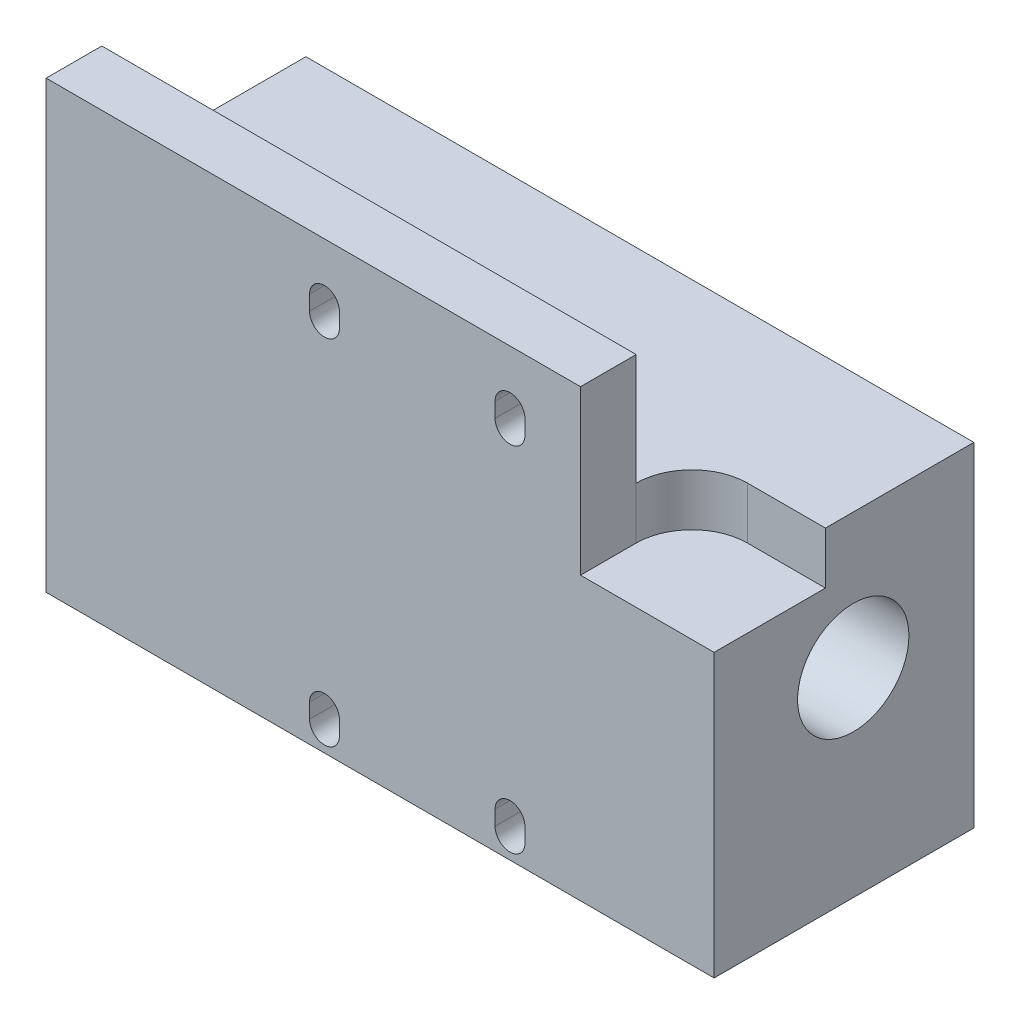
ISO-10303-21;
HEADER;
FILE_DESCRIPTION(('STEP AP214'),'2;1');
FILE_NAME('part.step','',(''),(''),'','','');
FILE_SCHEMA(('AUTOMOTIVE_DESIGN { 1 0 10303 214 1 1 1 1 }'));
ENDSEC;
DATA;
#1=APPLICATION_CONTEXT('core data for automotive mechanical design processes');
#2=APPLICATION_PROTOCOL_DEFINITION('international standard','automotive_design',2000,#1);
#3=PRODUCT_CONTEXT('',#1,'mechanical');
#4=PRODUCT('Part','Part','',(#3));
#5=PRODUCT_RELATED_PRODUCT_CATEGORY('part','',(#4));
#6=PRODUCT_DEFINITION_FORMATION('','',#4);
#7=PRODUCT_DEFINITION_CONTEXT('part definition',#1,'design');
#8=PRODUCT_DEFINITION('design','',#6,#7);
#9=PRODUCT_DEFINITION_SHAPE('','',#8);
#10=(LENGTH_UNIT() NAMED_UNIT(*) SI_UNIT(.MILLI.,.METRE.));
#11=(NAMED_UNIT(*) PLANE_ANGLE_UNIT() SI_UNIT($,.RADIAN.));
#12=(NAMED_UNIT(*) SI_UNIT($,.STERADIAN.) SOLID_ANGLE_UNIT());
#13=UNCERTAINTY_MEASURE_WITH_UNIT(LENGTH_MEASURE(1.E-05),#10,'distance_accuracy_value','');
#14=(GEOMETRIC_REPRESENTATION_CONTEXT(3) GLOBAL_UNCERTAINTY_ASSIGNED_CONTEXT((#13)) GLOBAL_UNIT_ASSIGNED_CONTEXT((#10,
#11,#12)) REPRESENTATION_CONTEXT('',''));
#15=CARTESIAN_POINT('',(0.,0.,0.));
#16=DIRECTION('',(0.,0.,1.));
#17=DIRECTION('',(1.,0.,0.));
#18=AXIS2_PLACEMENT_3D('',#15,#16,#17);
#19=CARTESIAN_POINT('',(114.3,38.1,-22.225));
#20=DIRECTION('',(0.,0.,1.));
#21=DIRECTION('',(0.,-1.,0.));
#22=AXIS2_PLACEMENT_3D('',#19,#20,#21);
#23=PLANE('',#22);
#24=CARTESIAN_POINT('',(79.375,-34.3535,-22.225));
#25=DIRECTION('',(0.,0.,1.));
#26=DIRECTION('',(0.,-1.,0.));
#27=AXIS2_PLACEMENT_3D('',#24,#25,#26);
#28=CIRCLE('',#27,2.55270000000001);
#29=CARTESIAN_POINT('',(81.9277,-34.3535,-22.225));
#30=VERTEX_POINT('',#29);
#31=CARTESIAN_POINT('',(76.8223,-34.3535,-22.225));
#32=VERTEX_POINT('',#31);
#33=EDGE_CURVE('E386',#30,#32,#28,.F.);
#34=ORIENTED_EDGE('',*,*,#33,.F.);
#35=DIRECTION('',(0.,-1.,0.));
#36=VECTOR('',#35,1.);
#37=CARTESIAN_POINT('',(81.9277,-31.8135,-22.225));
#38=LINE('',#37,#36);
#39=CARTESIAN_POINT('',(81.9277,-31.8135,-22.225));
#40=VERTEX_POINT('',#39);
#41=EDGE_CURVE('E389',#40,#30,#38,.T.);
#42=ORIENTED_EDGE('',*,*,#41,.F.);
#43=CARTESIAN_POINT('',(79.375,-31.8135,-22.225));
#44=DIRECTION('',(0.,0.,-1.));
#45=DIRECTION('',(0.,1.,0.));
#46=AXIS2_PLACEMENT_3D('',#43,#44,#45);
#47=CIRCLE('',#46,2.55269999999999);
#48=CARTESIAN_POINT('',(76.8223,-31.8135,-22.225));
#49=VERTEX_POINT('',#48);
#50=EDGE_CURVE('E470',#49,#40,#47,.T.);
#51=ORIENTED_EDGE('',*,*,#50,.F.);
#52=DIRECTION('',(0.,1.,0.));
#53=VECTOR('',#52,1.);
#54=CARTESIAN_POINT('',(76.8223,-31.8135,-22.225));
#55=LINE('',#54,#53);
#56=EDGE_CURVE('E58',#32,#49,#55,.T.);
#57=ORIENTED_EDGE('',*,*,#56,.F.);
#58=EDGE_LOOP('',(#34,#42,#51,#57));
#59=FACE_BOUND('',#58,.T.);
#60=DIRECTION('',(-1.,0.,0.));
#61=VECTOR('',#60,1.);
#62=CARTESIAN_POINT('',(114.301,19.05,-22.225));
#63=LINE('',#62,#61);
#64=CARTESIAN_POINT('',(114.3,19.05,-22.225));
#65=VERTEX_POINT('',#64);
#66=CARTESIAN_POINT('',(0.,19.05,-22.225));
#67=VERTEX_POINT('',#66);
#68=EDGE_CURVE('E252',#65,#67,#63,.T.);
#69=ORIENTED_EDGE('',*,*,#68,.F.);
#70=DIRECTION('',(0.,1.,0.));
#71=VECTOR('',#70,1.);
#72=CARTESIAN_POINT('',(114.3,38.1,-22.225));
#73=LINE('',#72,#71);
#74=CARTESIAN_POINT('',(114.3,-38.1,-22.225));
#75=VERTEX_POINT('',#74);
#76=EDGE_CURVE('E288',#75,#65,#73,.T.);
#77=ORIENTED_EDGE('',*,*,#76,.F.);
#78=DIRECTION('',(-1.,0.,0.));
#79=VECTOR('',#78,1.);
#80=CARTESIAN_POINT('',(114.3,-38.1,-22.225));
#81=LINE('',#80,#79);
#82=CARTESIAN_POINT('',(0.,-38.1,-22.225));
#83=VERTEX_POINT('',#82);
#84=EDGE_CURVE('E296',#75,#83,#81,.T.);
#85=ORIENTED_EDGE('',*,*,#84,.T.);
#86=DIRECTION('',(0.,1.,0.));
#87=VECTOR('',#86,1.);
#88=CARTESIAN_POINT('',(0.,38.1,-22.225));
#89=LINE('',#88,#87);
#90=EDGE_CURVE('E287',#83,#67,#89,.T.);
#91=ORIENTED_EDGE('',*,*,#90,.T.);
#92=EDGE_LOOP('',(#69,#77,#85,#91));
#93=FACE_BOUND('',#92,.T.);
#94=CARTESIAN_POINT('',(47.625,-34.3535,-22.225));
#95=DIRECTION('',(0.,0.,1.));
#96=DIRECTION('',(0.,-1.,0.));
#97=AXIS2_PLACEMENT_3D('',#94,#95,#96);
#98=CIRCLE('',#97,2.5527);
#99=CARTESIAN_POINT('',(50.1777,-34.3535,-22.225));
#100=VERTEX_POINT('',#99);
#101=CARTESIAN_POINT('',(45.0723,-34.3535,-22.225));
#102=VERTEX_POINT('',#101);
#103=EDGE_CURVE('E224',#100,#102,#98,.F.);
#104=ORIENTED_EDGE('',*,*,#103,.F.);
#105=DIRECTION('',(0.,-1.,0.));
#106=VECTOR('',#105,1.);
#107=CARTESIAN_POINT('',(50.1777,-31.8135,-22.225));
#108=LINE('',#107,#106);
#109=CARTESIAN_POINT('',(50.1777,-31.8135,-22.225));
#110=VERTEX_POINT('',#109);
#111=EDGE_CURVE('E490',#110,#100,#108,.T.);
#112=ORIENTED_EDGE('',*,*,#111,.F.);
#113=CARTESIAN_POINT('',(47.625,-31.8135,-22.225));
#114=DIRECTION('',(0.,0.,-1.));
#115=DIRECTION('',(0.,1.,0.));
#116=AXIS2_PLACEMENT_3D('',#113,#114,#115);
#117=CIRCLE('',#116,2.55269999999999);
#118=CARTESIAN_POINT('',(45.0723,-31.8135,-22.225));
#119=VERTEX_POINT('',#118);
#120=EDGE_CURVE('E223',#119,#110,#117,.T.);
#121=ORIENTED_EDGE('',*,*,#120,.F.);
#122=DIRECTION('',(0.,1.,0.));
#123=VECTOR('',#122,1.);
#124=CARTESIAN_POINT('',(45.0723,-31.8135,-22.225));
#125=LINE('',#124,#123);
#126=EDGE_CURVE('E50',#102,#119,#125,.T.);
#127=ORIENTED_EDGE('',*,*,#126,.F.);
#128=EDGE_LOOP('',(#104,#112,#121,#127));
#129=FACE_BOUND('',#128,.T.);
#130=ADVANCED_FACE('F35',(#59,#93,#129),#23,.F.);
#131=CARTESIAN_POINT('',(114.3,38.1,22.225));
#132=DIRECTION('',(0.,-1.,0.));
#133=DIRECTION('',(0.,0.,-1.));
#134=AXIS2_PLACEMENT_3D('',#131,#132,#133);
#135=PLANE('',#134);
#136=DIRECTION('',(-1.,0.,0.));
#137=VECTOR('',#136,1.);
#138=CARTESIAN_POINT('',(114.301,38.1,12.7));
#139=LINE('',#138,#137);
#140=CARTESIAN_POINT('',(91.44,38.1,12.7));
#141=VERTEX_POINT('',#140);
#142=CARTESIAN_POINT('',(0.,38.1,12.7));
#143=VERTEX_POINT('',#142);
#144=EDGE_CURVE('E256',#141,#143,#139,.T.);
#145=ORIENTED_EDGE('',*,*,#144,.T.);
#146=DIRECTION('',(0.,0.,1.));
#147=VECTOR('',#146,1.);
#148=CARTESIAN_POINT('',(0.,38.1,22.225));
#149=LINE('',#148,#147);
#150=CARTESIAN_POINT('',(0.,38.1,22.225));
#151=VERTEX_POINT('',#150);
#152=EDGE_CURVE('E299',#143,#151,#149,.T.);
#153=ORIENTED_EDGE('',*,*,#152,.T.);
#154=DIRECTION('',(-1.,0.,0.));
#155=VECTOR('',#154,1.);
#156=CARTESIAN_POINT('',(114.3,38.1,22.225));
#157=LINE('',#156,#155);
#158=CARTESIAN_POINT('',(91.44,38.1,22.225));
#159=VERTEX_POINT('',#158);
#160=EDGE_CURVE('E309',#159,#151,#157,.T.);
#161=ORIENTED_EDGE('',*,*,#160,.F.);
#162=DIRECTION('',(0.,0.,1.));
#163=VECTOR('',#162,1.);
#164=CARTESIAN_POINT('',(91.44,38.1,3.17499999999999));
#165=LINE('',#164,#163);
#166=EDGE_CURVE('E271',#141,#159,#165,.T.);
#167=ORIENTED_EDGE('',*,*,#166,.F.);
#168=EDGE_LOOP('',(#145,#153,#161,#167));
#169=FACE_BOUND('',#168,.T.);
#170=ADVANCED_FACE('F355',(#169),#135,.F.);
#171=CARTESIAN_POINT('',(114.3,0.,0.));
#172=DIRECTION('',(1.,0.,0.));
#173=DIRECTION('',(0.,0.,-1.));
#174=AXIS2_PLACEMENT_3D('',#171,#172,#173);
#175=PLANE('',#174);
#176=CARTESIAN_POINT('',(114.3,-4.01319999999999,-1.588));
#177=DIRECTION('',(1.,0.,0.));
#178=DIRECTION('',(0.,0.,-1.));
#179=AXIS2_PLACEMENT_3D('',#176,#177,#178);
#180=CIRCLE('',#179,9.525);
#181=CARTESIAN_POINT('',(114.3,-4.01319999999999,-11.113));
#182=VERTEX_POINT('',#181);
#183=EDGE_CURVE('E278',#182,#182,#180,.T.);
#184=ORIENTED_EDGE('',*,*,#183,.F.);
#185=EDGE_LOOP('',(#184));
#186=FACE_BOUND('',#185,.T.);
#187=ORIENTED_EDGE('',*,*,#76,.T.);
#188=DIRECTION('',(0.,0.,-1.));
#189=VECTOR('',#188,1.);
#190=CARTESIAN_POINT('',(114.3,19.05,-22.225));
#191=LINE('',#190,#189);
#192=CARTESIAN_POINT('',(114.3,19.05,3.17499999999999));
#193=VERTEX_POINT('',#192);
#194=EDGE_CURVE('E262',#193,#65,#191,.T.);
#195=ORIENTED_EDGE('',*,*,#194,.F.);
#196=DIRECTION('',(0.,1.,0.));
#197=VECTOR('',#196,1.);
#198=CARTESIAN_POINT('',(114.3,38.1,3.17499999999999));
#199=LINE('',#198,#197);
#200=CARTESIAN_POINT('',(114.3,10.16,3.17499999999999));
#201=VERTEX_POINT('',#200);
#202=EDGE_CURVE('E265',#201,#193,#199,.T.);
#203=ORIENTED_EDGE('',*,*,#202,.F.);
#204=DIRECTION('',(0.,0.,1.));
#205=VECTOR('',#204,1.);
#206=CARTESIAN_POINT('',(114.3,10.16,3.17499999999999));
#207=LINE('',#206,#205);
#208=CARTESIAN_POINT('',(114.3,10.16,22.225));
#209=VERTEX_POINT('',#208);
#210=EDGE_CURVE('E275',#201,#209,#207,.T.);
#211=ORIENTED_EDGE('',*,*,#210,.T.);
#212=DIRECTION('',(0.,-1.,0.));
#213=VECTOR('',#212,1.);
#214=CARTESIAN_POINT('',(114.3,38.1,22.225));
#215=LINE('',#214,#213);
#216=CARTESIAN_POINT('',(114.3,-38.1,22.225));
#217=VERTEX_POINT('',#216);
#218=EDGE_CURVE('E291',#209,#217,#215,.T.);
#219=ORIENTED_EDGE('',*,*,#218,.T.);
#220=DIRECTION('',(0.,0.,-1.));
#221=VECTOR('',#220,1.);
#222=CARTESIAN_POINT('',(114.3,-38.1,22.225));
#223=LINE('',#222,#221);
#224=EDGE_CURVE('E294',#217,#75,#223,.T.);
#225=ORIENTED_EDGE('',*,*,#224,.T.);
#226=EDGE_LOOP('',(#187,#195,#203,#211,#219,#225));
#227=FACE_BOUND('',#226,.T.);
#228=ADVANCED_FACE('F342',(#186,#227),#175,.T.);
#229=CARTESIAN_POINT('',(0.,0.,0.));
#230=DIRECTION('',(1.,0.,0.));
#231=DIRECTION('',(0.,0.,-1.));
#232=AXIS2_PLACEMENT_3D('',#229,#230,#231);
#233=PLANE('',#232);
#234=CARTESIAN_POINT('',(0.,-4.01319999999999,-1.588));
#235=DIRECTION('',(1.,0.,0.));
#236=DIRECTION('',(0.,0.,-1.));
#237=AXIS2_PLACEMENT_3D('',#234,#235,#236);
#238=CIRCLE('',#237,9.525);
#239=CARTESIAN_POINT('',(0.,-4.01319999999999,-11.113));
#240=VERTEX_POINT('',#239);
#241=EDGE_CURVE('E284',#240,#240,#238,.F.);
#242=ORIENTED_EDGE('',*,*,#241,.F.);
#243=EDGE_LOOP('',(#242));
#244=FACE_BOUND('',#243,.T.);
#245=DIRECTION('',(0.,-1.,0.));
#246=VECTOR('',#245,1.);
#247=CARTESIAN_POINT('',(0.,38.1,12.7));
#248=LINE('',#247,#246);
#249=CARTESIAN_POINT('',(0.,19.05,12.7));
#250=VERTEX_POINT('',#249);
#251=EDGE_CURVE('E246',#143,#250,#248,.T.);
#252=ORIENTED_EDGE('',*,*,#251,.T.);
#253=DIRECTION('',(0.,0.,-1.));
#254=VECTOR('',#253,1.);
#255=CARTESIAN_POINT('',(0.,19.05,-22.225));
#256=LINE('',#255,#254);
#257=EDGE_CURVE('E249',#250,#67,#256,.T.);
#258=ORIENTED_EDGE('',*,*,#257,.T.);
#259=ORIENTED_EDGE('',*,*,#90,.F.);
#260=DIRECTION('',(0.,0.,-1.));
#261=VECTOR('',#260,1.);
#262=CARTESIAN_POINT('',(0.,-38.1,22.225));
#263=LINE('',#262,#261);
#264=CARTESIAN_POINT('',(0.,-38.1,22.225));
#265=VERTEX_POINT('',#264);
#266=EDGE_CURVE('E292',#265,#83,#263,.T.);
#267=ORIENTED_EDGE('',*,*,#266,.F.);
#268=DIRECTION('',(0.,-1.,0.));
#269=VECTOR('',#268,1.);
#270=CARTESIAN_POINT('',(0.,38.1,22.225));
#271=LINE('',#270,#269);
#272=EDGE_CURVE('E301',#151,#265,#271,.T.);
#273=ORIENTED_EDGE('',*,*,#272,.F.);
#274=ORIENTED_EDGE('',*,*,#152,.F.);
#275=EDGE_LOOP('',(#252,#258,#259,#267,#273,#274));
#276=FACE_BOUND('',#275,.T.);
#277=ADVANCED_FACE('F351',(#244,#276),#233,.F.);
#278=CARTESIAN_POINT('',(91.44,38.1,3.17499999999999));
#279=DIRECTION('',(-1.,0.,0.));
#280=DIRECTION('',(0.,0.,1.));
#281=AXIS2_PLACEMENT_3D('',#278,#279,#280);
#282=PLANE('',#281);
#283=DIRECTION('',(0.,0.,1.));
#284=VECTOR('',#283,1.);
#285=CARTESIAN_POINT('',(91.44,10.16,3.17499999999999));
#286=LINE('',#285,#284);
#287=CARTESIAN_POINT('',(91.44,10.16,12.7));
#288=VERTEX_POINT('',#287);
#289=CARTESIAN_POINT('',(91.44,10.16,22.225));
#290=VERTEX_POINT('',#289);
#291=EDGE_CURVE('E279',#288,#290,#286,.T.);
#292=ORIENTED_EDGE('',*,*,#291,.F.);
#293=DIRECTION('',(0.,-1.,0.));
#294=VECTOR('',#293,1.);
#295=CARTESIAN_POINT('',(91.44,19.05,12.7));
#296=LINE('',#295,#294);
#297=CARTESIAN_POINT('',(91.44,19.05,12.7));
#298=VERTEX_POINT('',#297);
#299=EDGE_CURVE('E43',#288,#298,#296,.F.);
#300=ORIENTED_EDGE('',*,*,#299,.T.);
#301=DIRECTION('',(0.,1.,0.));
#302=VECTOR('',#301,1.);
#303=CARTESIAN_POINT('',(91.44,38.1,12.7));
#304=LINE('',#303,#302);
#305=EDGE_CURVE('E243',#298,#141,#304,.T.);
#306=ORIENTED_EDGE('',*,*,#305,.T.);
#307=ORIENTED_EDGE('',*,*,#166,.T.);
#308=DIRECTION('',(0.,-1.,0.));
#309=VECTOR('',#308,1.);
#310=CARTESIAN_POINT('',(91.44,38.1,22.225));
#311=LINE('',#310,#309);
#312=EDGE_CURVE('E264',#159,#290,#311,.T.);
#313=ORIENTED_EDGE('',*,*,#312,.T.);
#314=EDGE_LOOP('',(#292,#300,#306,#307,#313));
#315=FACE_BOUND('',#314,.T.);
#316=ADVANCED_FACE('F320',(#315),#282,.F.);
#317=CARTESIAN_POINT('',(0.,0.,3.17499999999999));
#318=DIRECTION('',(0.,0.,-1.));
#319=DIRECTION('',(-1.,0.,0.));
#320=AXIS2_PLACEMENT_3D('',#317,#318,#319);
#321=PLANE('',#320);
#322=DIRECTION('',(-1.,0.,0.));
#323=VECTOR('',#322,1.);
#324=CARTESIAN_POINT('',(114.301,19.05,3.17499999999999));
#325=LINE('',#324,#323);
#326=CARTESIAN_POINT('',(100.965,19.05,3.17499999999999));
#327=VERTEX_POINT('',#326);
#328=EDGE_CURVE('E259',#193,#327,#325,.T.);
#329=ORIENTED_EDGE('',*,*,#328,.T.);
#330=DIRECTION('',(0.,-1.,0.));
#331=VECTOR('',#330,1.);
#332=CARTESIAN_POINT('',(100.965,10.16,3.17499999999999));
#333=LINE('',#332,#331);
#334=CARTESIAN_POINT('',(100.965,10.16,3.17499999999999));
#335=VERTEX_POINT('',#334);
#336=EDGE_CURVE('E312',#327,#335,#333,.T.);
#337=ORIENTED_EDGE('',*,*,#336,.T.);
#338=DIRECTION('',(1.,0.,0.));
#339=VECTOR('',#338,1.);
#340=CARTESIAN_POINT('',(114.3,10.16,3.17499999999999));
#341=LINE('',#340,#339);
#342=EDGE_CURVE('E268',#335,#201,#341,.T.);
#343=ORIENTED_EDGE('',*,*,#342,.T.);
#344=ORIENTED_EDGE('',*,*,#202,.T.);
#345=EDGE_LOOP('',(#329,#337,#343,#344));
#346=FACE_BOUND('',#345,.T.);
#347=ADVANCED_FACE('F333',(#346),#321,.F.);
#348=CARTESIAN_POINT('',(114.3,38.1,22.225));
#349=DIRECTION('',(0.,0.,-1.));
#350=DIRECTION('',(0.,1.,0.));
#351=AXIS2_PLACEMENT_3D('',#348,#349,#350);
#352=PLANE('',#351);
#353=CARTESIAN_POINT('',(47.625,28.6385,22.225));
#354=DIRECTION('',(0.,0.,-1.));
#355=DIRECTION('',(0.,1.,0.));
#356=AXIS2_PLACEMENT_3D('',#353,#354,#355);
#357=CIRCLE('',#356,2.55269999999999);
#358=CARTESIAN_POINT('',(45.0723,28.6385,22.225));
#359=VERTEX_POINT('',#358);
#360=CARTESIAN_POINT('',(50.1777,28.6385,22.225));
#361=VERTEX_POINT('',#360);
#362=EDGE_CURVE('E464',#359,#361,#357,.T.);
#363=ORIENTED_EDGE('',*,*,#362,.T.);
#364=DIRECTION('',(0.,1.,0.));
#365=VECTOR('',#364,1.);
#366=CARTESIAN_POINT('',(50.1777,28.6385,22.225));
#367=LINE('',#366,#365);
#368=CARTESIAN_POINT('',(50.1777,26.0985,22.225));
#369=VERTEX_POINT('',#368);
#370=EDGE_CURVE('E455',#369,#361,#367,.T.);
#371=ORIENTED_EDGE('',*,*,#370,.F.);
#372=CARTESIAN_POINT('',(47.625,26.0985,22.225));
#373=DIRECTION('',(0.,0.,1.));
#374=DIRECTION('',(1.,0.,0.));
#375=AXIS2_PLACEMENT_3D('',#372,#373,#374);
#376=CIRCLE('',#375,2.55269999999998);
#377=CARTESIAN_POINT('',(45.0723,26.0985,22.225));
#378=VERTEX_POINT('',#377);
#379=EDGE_CURVE('E452',#378,#369,#376,.T.);
#380=ORIENTED_EDGE('',*,*,#379,.F.);
#381=DIRECTION('',(0.,-1.,0.));
#382=VECTOR('',#381,1.);
#383=CARTESIAN_POINT('',(45.0723,28.6385,22.225));
#384=LINE('',#383,#382);
#385=EDGE_CURVE('E449',#359,#378,#384,.T.);
#386=ORIENTED_EDGE('',*,*,#385,.F.);
#387=EDGE_LOOP('',(#363,#371,#380,#386));
#388=FACE_BOUND('',#387,.T.);
#389=CARTESIAN_POINT('',(79.375,-31.8135,22.225));
#390=DIRECTION('',(0.,0.,-1.));
#391=DIRECTION('',(0.,1.,0.));
#392=AXIS2_PLACEMENT_3D('',#389,#390,#391);
#393=CIRCLE('',#392,2.55269999999999);
#394=CARTESIAN_POINT('',(76.8223,-31.8135,22.225));
#395=VERTEX_POINT('',#394);
#396=CARTESIAN_POINT('',(81.9277,-31.8135,22.225));
#397=VERTEX_POINT('',#396);
#398=EDGE_CURVE('E237',#395,#397,#393,.T.);
#399=ORIENTED_EDGE('',*,*,#398,.T.);
#400=DIRECTION('',(0.,1.,0.));
#401=VECTOR('',#400,1.);
#402=CARTESIAN_POINT('',(81.9277,-31.8135,22.225));
#403=LINE('',#402,#401);
#404=CARTESIAN_POINT('',(81.9277,-34.3535,22.225));
#405=VERTEX_POINT('',#404);
#406=EDGE_CURVE('E405',#405,#397,#403,.T.);
#407=ORIENTED_EDGE('',*,*,#406,.F.);
#408=CARTESIAN_POINT('',(79.375,-34.3535,22.225));
#409=DIRECTION('',(0.,0.,1.));
#410=DIRECTION('',(1.,0.,0.));
#411=AXIS2_PLACEMENT_3D('',#408,#409,#410);
#412=CIRCLE('',#411,2.55270000000001);
#413=CARTESIAN_POINT('',(76.8223,-34.3535,22.225));
#414=VERTEX_POINT('',#413);
#415=EDGE_CURVE('E402',#414,#405,#412,.T.);
#416=ORIENTED_EDGE('',*,*,#415,.F.);
#417=DIRECTION('',(0.,-1.,0.));
#418=VECTOR('',#417,1.);
#419=CARTESIAN_POINT('',(76.8223,-31.8135,22.225));
#420=LINE('',#419,#418);
#421=EDGE_CURVE('E394',#395,#414,#420,.T.);
#422=ORIENTED_EDGE('',*,*,#421,.F.);
#423=EDGE_LOOP('',(#399,#407,#416,#422));
#424=FACE_BOUND('',#423,.T.);
#425=CARTESIAN_POINT('',(47.625,-31.8135,22.225));
#426=DIRECTION('',(0.,0.,-1.));
#427=DIRECTION('',(0.,1.,0.));
#428=AXIS2_PLACEMENT_3D('',#425,#426,#427);
#429=CIRCLE('',#428,2.55269999999999);
#430=CARTESIAN_POINT('',(45.0723,-31.8135,22.225));
#431=VERTEX_POINT('',#430);
#432=CARTESIAN_POINT('',(50.1777,-31.8135,22.225));
#433=VERTEX_POINT('',#432);
#434=EDGE_CURVE('E221',#431,#433,#429,.T.);
#435=ORIENTED_EDGE('',*,*,#434,.T.);
#436=DIRECTION('',(0.,1.,0.));
#437=VECTOR('',#436,1.);
#438=CARTESIAN_POINT('',(50.1777,-31.8135,22.225));
#439=LINE('',#438,#437);
#440=CARTESIAN_POINT('',(50.1777,-34.3535,22.225));
#441=VERTEX_POINT('',#440);
#442=EDGE_CURVE('E203',#441,#433,#439,.T.);
#443=ORIENTED_EDGE('',*,*,#442,.F.);
#444=CARTESIAN_POINT('',(47.625,-34.3535,22.225));
#445=DIRECTION('',(0.,0.,1.));
#446=DIRECTION('',(1.,0.,0.));
#447=AXIS2_PLACEMENT_3D('',#444,#445,#446);
#448=CIRCLE('',#447,2.5527);
#449=CARTESIAN_POINT('',(45.0723,-34.3535,22.225));
#450=VERTEX_POINT('',#449);
#451=EDGE_CURVE('E215',#450,#441,#448,.T.);
#452=ORIENTED_EDGE('',*,*,#451,.F.);
#453=DIRECTION('',(0.,-1.,0.));
#454=VECTOR('',#453,1.);
#455=CARTESIAN_POINT('',(45.0723,-31.8135,22.225));
#456=LINE('',#455,#454);
#457=EDGE_CURVE('E231',#431,#450,#456,.T.);
#458=ORIENTED_EDGE('',*,*,#457,.F.);
#459=EDGE_LOOP('',(#435,#443,#452,#458));
#460=FACE_BOUND('',#459,.T.);
#461=CARTESIAN_POINT('',(79.375,28.6385,22.225));
#462=DIRECTION('',(0.,0.,-1.));
#463=DIRECTION('',(0.,1.,0.));
#464=AXIS2_PLACEMENT_3D('',#461,#462,#463);
#465=CIRCLE('',#464,2.55269999999999);
#466=CARTESIAN_POINT('',(76.8223,28.6385,22.225));
#467=VERTEX_POINT('',#466);
#468=CARTESIAN_POINT('',(81.9277,28.6385,22.225));
#469=VERTEX_POINT('',#468);
#470=EDGE_CURVE('E232',#467,#469,#465,.T.);
#471=ORIENTED_EDGE('',*,*,#470,.T.);
#472=DIRECTION('',(0.,1.,0.));
#473=VECTOR('',#472,1.);
#474=CARTESIAN_POINT('',(81.9277,28.6385,22.225));
#475=LINE('',#474,#473);
#476=CARTESIAN_POINT('',(81.9277,26.0985,22.225));
#477=VERTEX_POINT('',#476);
#478=EDGE_CURVE('E429',#477,#469,#475,.T.);
#479=ORIENTED_EDGE('',*,*,#478,.F.);
#480=CARTESIAN_POINT('',(79.375,26.0985,22.225));
#481=DIRECTION('',(0.,0.,1.));
#482=DIRECTION('',(1.,0.,0.));
#483=AXIS2_PLACEMENT_3D('',#480,#481,#482);
#484=CIRCLE('',#483,2.55270000000001);
#485=CARTESIAN_POINT('',(76.8223,26.0985,22.225));
#486=VERTEX_POINT('',#485);
#487=EDGE_CURVE('E426',#486,#477,#484,.T.);
#488=ORIENTED_EDGE('',*,*,#487,.F.);
#489=DIRECTION('',(0.,-1.,0.));
#490=VECTOR('',#489,1.);
#491=CARTESIAN_POINT('',(76.8223,28.6385,22.225));
#492=LINE('',#491,#490);
#493=EDGE_CURVE('E423',#467,#486,#492,.T.);
#494=ORIENTED_EDGE('',*,*,#493,.F.);
#495=EDGE_LOOP('',(#471,#479,#488,#494));
#496=FACE_BOUND('',#495,.T.);
#497=ORIENTED_EDGE('',*,*,#218,.F.);
#498=DIRECTION('',(1.,0.,0.));
#499=VECTOR('',#498,1.);
#500=CARTESIAN_POINT('',(114.3,10.16,22.225));
#501=LINE('',#500,#499);
#502=EDGE_CURVE('E269',#290,#209,#501,.T.);
#503=ORIENTED_EDGE('',*,*,#502,.F.);
#504=ORIENTED_EDGE('',*,*,#312,.F.);
#505=ORIENTED_EDGE('',*,*,#160,.T.);
#506=ORIENTED_EDGE('',*,*,#272,.T.);
#507=DIRECTION('',(-1.,0.,0.));
#508=VECTOR('',#507,1.);
#509=CARTESIAN_POINT('',(114.3,-38.1,22.225));
#510=LINE('',#509,#508);
#511=EDGE_CURVE('E306',#217,#265,#510,.T.);
#512=ORIENTED_EDGE('',*,*,#511,.F.);
#513=EDGE_LOOP('',(#497,#503,#504,#505,#506,#512));
#514=FACE_BOUND('',#513,.T.);
#515=ADVANCED_FACE('F228',(#388,#424,#460,#496,#514),#352,.F.);
#516=CARTESIAN_POINT('',(114.3,-38.1,22.225));
#517=DIRECTION('',(0.,1.,0.));
#518=DIRECTION('',(0.,0.,1.));
#519=AXIS2_PLACEMENT_3D('',#516,#517,#518);
#520=PLANE('',#519);
#521=ORIENTED_EDGE('',*,*,#266,.T.);
#522=ORIENTED_EDGE('',*,*,#84,.F.);
#523=ORIENTED_EDGE('',*,*,#224,.F.);
#524=ORIENTED_EDGE('',*,*,#511,.T.);
#525=EDGE_LOOP('',(#521,#522,#523,#524));
#526=FACE_BOUND('',#525,.T.);
#527=ADVANCED_FACE('F362',(#526),#520,.F.);
#528=CARTESIAN_POINT('',(-0.001000000000001,-4.01319999999999,-1.588));
#529=DIRECTION('',(1.,0.,0.));
#530=DIRECTION('',(0.,0.,-1.));
#531=AXIS2_PLACEMENT_3D('',#528,#529,#530);
#532=CYLINDRICAL_SURFACE('',#531,9.525);
#533=ORIENTED_EDGE('',*,*,#183,.T.);
#534=EDGE_LOOP('',(#533));
#535=FACE_BOUND('',#534,.T.);
#536=ORIENTED_EDGE('',*,*,#241,.T.);
#537=EDGE_LOOP('',(#536));
#538=FACE_BOUND('',#537,.T.);
#539=ADVANCED_FACE('F364',(#535,#538),#532,.F.);
#540=CARTESIAN_POINT('',(114.3,10.16,3.17499999999999));
#541=DIRECTION('',(0.,-1.,0.));
#542=DIRECTION('',(1.,0.,0.));
#543=AXIS2_PLACEMENT_3D('',#540,#541,#542);
#544=PLANE('',#543);
#545=ORIENTED_EDGE('',*,*,#342,.F.);
#546=CARTESIAN_POINT('',(100.965,10.16,12.7));
#547=DIRECTION('',(0.,-1.,0.));
#548=DIRECTION('',(1.,0.,0.));
#549=AXIS2_PLACEMENT_3D('',#546,#547,#548);
#550=CIRCLE('',#549,9.525);
#551=EDGE_CURVE('E315',#335,#288,#550,.F.);
#552=ORIENTED_EDGE('',*,*,#551,.T.);
#553=ORIENTED_EDGE('',*,*,#291,.T.);
#554=ORIENTED_EDGE('',*,*,#502,.T.);
#555=ORIENTED_EDGE('',*,*,#210,.F.);
#556=EDGE_LOOP('',(#545,#552,#553,#554,#555));
#557=FACE_BOUND('',#556,.T.);
#558=ADVANCED_FACE('F336',(#557),#544,.F.);
#559=CARTESIAN_POINT('',(114.301,38.1,12.7));
#560=DIRECTION('',(0.,0.,-1.));
#561=DIRECTION('',(0.,1.,0.));
#562=AXIS2_PLACEMENT_3D('',#559,#560,#561);
#563=PLANE('',#562);
#564=DIRECTION('',(0.,1.,0.));
#565=VECTOR('',#564,1.);
#566=CARTESIAN_POINT('',(81.9277,28.6385,12.7));
#567=LINE('',#566,#565);
#568=CARTESIAN_POINT('',(81.9277,26.0985,12.7));
#569=VERTEX_POINT('',#568);
#570=CARTESIAN_POINT('',(81.9277,28.6385,12.7));
#571=VERTEX_POINT('',#570);
#572=EDGE_CURVE('E420',#569,#571,#567,.T.);
#573=ORIENTED_EDGE('',*,*,#572,.T.);
#574=CARTESIAN_POINT('',(79.375,28.6385,12.7));
#575=DIRECTION('',(0.,0.,-1.));
#576=DIRECTION('',(0.,1.,0.));
#577=AXIS2_PLACEMENT_3D('',#574,#575,#576);
#578=CIRCLE('',#577,2.55269999999999);
#579=CARTESIAN_POINT('',(76.8223,28.6385,12.7));
#580=VERTEX_POINT('',#579);
#581=EDGE_CURVE('E235',#580,#571,#578,.T.);
#582=ORIENTED_EDGE('',*,*,#581,.F.);
#583=DIRECTION('',(0.,-1.,0.));
#584=VECTOR('',#583,1.);
#585=CARTESIAN_POINT('',(76.8223,28.6385,12.7));
#586=LINE('',#585,#584);
#587=CARTESIAN_POINT('',(76.8223,26.0985,12.7));
#588=VERTEX_POINT('',#587);
#589=EDGE_CURVE('E434',#580,#588,#586,.T.);
#590=ORIENTED_EDGE('',*,*,#589,.T.);
#591=CARTESIAN_POINT('',(79.375,26.0985,12.7));
#592=DIRECTION('',(0.,0.,-1.));
#593=DIRECTION('',(0.,1.,0.));
#594=AXIS2_PLACEMENT_3D('',#591,#592,#593);
#595=CIRCLE('',#594,2.55270000000001);
#596=EDGE_CURVE('E417',#588,#569,#595,.F.);
#597=ORIENTED_EDGE('',*,*,#596,.T.);
#598=EDGE_LOOP('',(#573,#582,#590,#597));
#599=FACE_BOUND('',#598,.T.);
#600=DIRECTION('',(0.,1.,0.));
#601=VECTOR('',#600,1.);
#602=CARTESIAN_POINT('',(50.1777,28.6385,12.7));
#603=LINE('',#602,#601);
#604=CARTESIAN_POINT('',(50.1777,26.0985,12.7));
#605=VERTEX_POINT('',#604);
#606=CARTESIAN_POINT('',(50.1777,28.6385,12.7));
#607=VERTEX_POINT('',#606);
#608=EDGE_CURVE('E446',#605,#607,#603,.T.);
#609=ORIENTED_EDGE('',*,*,#608,.T.);
#610=CARTESIAN_POINT('',(47.625,28.6385,12.7));
#611=DIRECTION('',(0.,0.,-1.));
#612=DIRECTION('',(0.,1.,0.));
#613=AXIS2_PLACEMENT_3D('',#610,#611,#612);
#614=CIRCLE('',#613,2.55269999999999);
#615=CARTESIAN_POINT('',(45.0723,28.6385,12.7));
#616=VERTEX_POINT('',#615);
#617=EDGE_CURVE('E467',#616,#607,#614,.T.);
#618=ORIENTED_EDGE('',*,*,#617,.F.);
#619=DIRECTION('',(0.,-1.,0.));
#620=VECTOR('',#619,1.);
#621=CARTESIAN_POINT('',(45.0723,28.6385,12.7));
#622=LINE('',#621,#620);
#623=CARTESIAN_POINT('',(45.0723,26.0985,12.7));
#624=VERTEX_POINT('',#623);
#625=EDGE_CURVE('E460',#616,#624,#622,.T.);
#626=ORIENTED_EDGE('',*,*,#625,.T.);
#627=CARTESIAN_POINT('',(47.625,26.0985,12.7));
#628=DIRECTION('',(0.,0.,-1.));
#629=DIRECTION('',(0.,1.,0.));
#630=AXIS2_PLACEMENT_3D('',#627,#628,#629);
#631=CIRCLE('',#630,2.55269999999998);
#632=EDGE_CURVE('E443',#624,#605,#631,.F.);
#633=ORIENTED_EDGE('',*,*,#632,.T.);
#634=EDGE_LOOP('',(#609,#618,#626,#633));
#635=FACE_BOUND('',#634,.T.);
#636=DIRECTION('',(-1.,0.,0.));
#637=VECTOR('',#636,1.);
#638=CARTESIAN_POINT('',(114.301,19.05,12.7));
#639=LINE('',#638,#637);
#640=EDGE_CURVE('E254',#298,#250,#639,.T.);
#641=ORIENTED_EDGE('',*,*,#640,.T.);
#642=ORIENTED_EDGE('',*,*,#251,.F.);
#643=ORIENTED_EDGE('',*,*,#144,.F.);
#644=ORIENTED_EDGE('',*,*,#305,.F.);
#645=EDGE_LOOP('',(#641,#642,#643,#644));
#646=FACE_BOUND('',#645,.T.);
#647=ADVANCED_FACE('F326',(#599,#635,#646),#563,.T.);
#648=CARTESIAN_POINT('',(114.301,19.05,-22.225));
#649=DIRECTION('',(0.,1.,0.));
#650=DIRECTION('',(0.,0.,1.));
#651=AXIS2_PLACEMENT_3D('',#648,#649,#650);
#652=PLANE('',#651);
#653=ORIENTED_EDGE('',*,*,#194,.T.);
#654=ORIENTED_EDGE('',*,*,#68,.T.);
#655=ORIENTED_EDGE('',*,*,#257,.F.);
#656=ORIENTED_EDGE('',*,*,#640,.F.);
#657=CARTESIAN_POINT('',(100.965,19.05,12.7));
#658=DIRECTION('',(0.,1.,0.));
#659=DIRECTION('',(0.,0.,1.));
#660=AXIS2_PLACEMENT_3D('',#657,#658,#659);
#661=CIRCLE('',#660,9.525);
#662=EDGE_CURVE('E11',#298,#327,#661,.F.);
#663=ORIENTED_EDGE('',*,*,#662,.T.);
#664=ORIENTED_EDGE('',*,*,#328,.F.);
#665=EDGE_LOOP('',(#653,#654,#655,#656,#663,#664));
#666=FACE_BOUND('',#665,.T.);
#667=ADVANCED_FACE('F329',(#666),#652,.T.);
#668=CARTESIAN_POINT('',(100.965,0.,12.7));
#669=DIRECTION('',(0.,1.,0.));
#670=DIRECTION('',(0.,0.,1.));
#671=AXIS2_PLACEMENT_3D('',#668,#669,#670);
#672=CYLINDRICAL_SURFACE('',#671,9.525);
#673=ORIENTED_EDGE('',*,*,#662,.F.);
#674=ORIENTED_EDGE('',*,*,#299,.F.);
#675=ORIENTED_EDGE('',*,*,#551,.F.);
#676=ORIENTED_EDGE('',*,*,#336,.F.);
#677=EDGE_LOOP('',(#673,#674,#675,#676));
#678=FACE_BOUND('',#677,.T.);
#679=ADVANCED_FACE('F37',(#678),#672,.F.);
#680=CARTESIAN_POINT('',(79.375,28.6385,-22.225));
#681=DIRECTION('',(0.,0.,-1.));
#682=DIRECTION('',(0.,1.,0.));
#683=AXIS2_PLACEMENT_3D('',#680,#681,#682);
#684=CYLINDRICAL_SURFACE('',#683,2.55269999999999);
#685=ORIENTED_EDGE('',*,*,#581,.T.);
#686=DIRECTION('',(0.,0.,-1.));
#687=VECTOR('',#686,1.);
#688=CARTESIAN_POINT('',(81.9277,28.6385,-22.225));
#689=LINE('',#688,#687);
#690=EDGE_CURVE('E415',#469,#571,#689,.T.);
#691=ORIENTED_EDGE('',*,*,#690,.F.);
#692=ORIENTED_EDGE('',*,*,#470,.F.);
#693=DIRECTION('',(0.,0.,-1.));
#694=VECTOR('',#693,1.);
#695=CARTESIAN_POINT('',(76.8223,28.6385,-22.225));
#696=LINE('',#695,#694);
#697=EDGE_CURVE('E412',#467,#580,#696,.T.);
#698=ORIENTED_EDGE('',*,*,#697,.T.);
#699=EDGE_LOOP('',(#685,#691,#692,#698));
#700=FACE_BOUND('',#699,.T.);
#701=ADVANCED_FACE('F544',(#700),#684,.F.);
#702=CARTESIAN_POINT('',(47.625,-31.8135,-22.225));
#703=DIRECTION('',(0.,0.,-1.));
#704=DIRECTION('',(0.,1.,0.));
#705=AXIS2_PLACEMENT_3D('',#702,#703,#704);
#706=CYLINDRICAL_SURFACE('',#705,2.55269999999999);
#707=ORIENTED_EDGE('',*,*,#120,.T.);
#708=DIRECTION('',(0.,0.,-1.));
#709=VECTOR('',#708,1.);
#710=CARTESIAN_POINT('',(50.1777,-31.8135,-22.225));
#711=LINE('',#710,#709);
#712=EDGE_CURVE('E207',#433,#110,#711,.T.);
#713=ORIENTED_EDGE('',*,*,#712,.F.);
#714=ORIENTED_EDGE('',*,*,#434,.F.);
#715=DIRECTION('',(0.,0.,-1.));
#716=VECTOR('',#715,1.);
#717=CARTESIAN_POINT('',(45.0723,-31.8135,-22.225));
#718=LINE('',#717,#716);
#719=EDGE_CURVE('E225',#431,#119,#718,.T.);
#720=ORIENTED_EDGE('',*,*,#719,.T.);
#721=EDGE_LOOP('',(#707,#713,#714,#720));
#722=FACE_BOUND('',#721,.T.);
#723=ADVANCED_FACE('F220',(#722),#706,.F.);
#724=CARTESIAN_POINT('',(79.375,-31.8135,-22.225));
#725=DIRECTION('',(0.,0.,-1.));
#726=DIRECTION('',(0.,1.,0.));
#727=AXIS2_PLACEMENT_3D('',#724,#725,#726);
#728=CYLINDRICAL_SURFACE('',#727,2.55269999999999);
#729=ORIENTED_EDGE('',*,*,#50,.T.);
#730=DIRECTION('',(0.,0.,-1.));
#731=VECTOR('',#730,1.);
#732=CARTESIAN_POINT('',(81.9277,-31.8135,-22.225));
#733=LINE('',#732,#731);
#734=EDGE_CURVE('E392',#397,#40,#733,.T.);
#735=ORIENTED_EDGE('',*,*,#734,.F.);
#736=ORIENTED_EDGE('',*,*,#398,.F.);
#737=DIRECTION('',(0.,0.,-1.));
#738=VECTOR('',#737,1.);
#739=CARTESIAN_POINT('',(76.8223,-31.8135,-22.225));
#740=LINE('',#739,#738);
#741=EDGE_CURVE('E396',#395,#49,#740,.T.);
#742=ORIENTED_EDGE('',*,*,#741,.T.);
#743=EDGE_LOOP('',(#729,#735,#736,#742));
#744=FACE_BOUND('',#743,.T.);
#745=ADVANCED_FACE('F479',(#744),#728,.F.);
#746=CARTESIAN_POINT('',(47.625,28.6385,-22.225));
#747=DIRECTION('',(0.,0.,-1.));
#748=DIRECTION('',(0.,1.,0.));
#749=AXIS2_PLACEMENT_3D('',#746,#747,#748);
#750=CYLINDRICAL_SURFACE('',#749,2.55269999999999);
#751=ORIENTED_EDGE('',*,*,#617,.T.);
#752=DIRECTION('',(0.,0.,-1.));
#753=VECTOR('',#752,1.);
#754=CARTESIAN_POINT('',(50.1777,28.6385,-22.225));
#755=LINE('',#754,#753);
#756=EDGE_CURVE('E441',#361,#607,#755,.T.);
#757=ORIENTED_EDGE('',*,*,#756,.F.);
#758=ORIENTED_EDGE('',*,*,#362,.F.);
#759=DIRECTION('',(0.,0.,-1.));
#760=VECTOR('',#759,1.);
#761=CARTESIAN_POINT('',(45.0723,28.6385,-22.225));
#762=LINE('',#761,#760);
#763=EDGE_CURVE('E438',#359,#616,#762,.T.);
#764=ORIENTED_EDGE('',*,*,#763,.T.);
#765=EDGE_LOOP('',(#751,#757,#758,#764));
#766=FACE_BOUND('',#765,.T.);
#767=ADVANCED_FACE('F529',(#766),#750,.F.);
#768=CARTESIAN_POINT('',(50.1777,28.6385,-22.226));
#769=DIRECTION('',(1.,0.,0.));
#770=DIRECTION('',(0.,0.,-1.));
#771=AXIS2_PLACEMENT_3D('',#768,#769,#770);
#772=PLANE('',#771);
#773=DIRECTION('',(0.,0.,1.));
#774=VECTOR('',#773,1.);
#775=CARTESIAN_POINT('',(50.1777,26.0985,-22.226));
#776=LINE('',#775,#774);
#777=EDGE_CURVE('E458',#605,#369,#776,.T.);
#778=ORIENTED_EDGE('',*,*,#777,.T.);
#779=ORIENTED_EDGE('',*,*,#370,.T.);
#780=ORIENTED_EDGE('',*,*,#756,.T.);
#781=ORIENTED_EDGE('',*,*,#608,.F.);
#782=EDGE_LOOP('',(#778,#779,#780,#781));
#783=FACE_BOUND('',#782,.T.);
#784=ADVANCED_FACE('F525',(#783),#772,.F.);
#785=CARTESIAN_POINT('',(47.625,26.0985,-22.226));
#786=DIRECTION('',(0.,0.,1.));
#787=DIRECTION('',(1.,0.,0.));
#788=AXIS2_PLACEMENT_3D('',#785,#786,#787);
#789=CYLINDRICAL_SURFACE('',#788,2.55269999999998);
#790=DIRECTION('',(0.,0.,1.));
#791=VECTOR('',#790,1.);
#792=CARTESIAN_POINT('',(45.0723,26.0985,-22.226));
#793=LINE('',#792,#791);
#794=EDGE_CURVE('E457',#624,#378,#793,.T.);
#795=ORIENTED_EDGE('',*,*,#794,.T.);
#796=ORIENTED_EDGE('',*,*,#379,.T.);
#797=ORIENTED_EDGE('',*,*,#777,.F.);
#798=ORIENTED_EDGE('',*,*,#632,.F.);
#799=EDGE_LOOP('',(#795,#796,#797,#798));
#800=FACE_BOUND('',#799,.T.);
#801=ADVANCED_FACE('F528',(#800),#789,.F.);
#802=CARTESIAN_POINT('',(45.0723,28.6385,-22.226));
#803=DIRECTION('',(-1.,0.,0.));
#804=DIRECTION('',(0.,-1.,0.));
#805=AXIS2_PLACEMENT_3D('',#802,#803,#804);
#806=PLANE('',#805);
#807=ORIENTED_EDGE('',*,*,#763,.F.);
#808=ORIENTED_EDGE('',*,*,#385,.T.);
#809=ORIENTED_EDGE('',*,*,#794,.F.);
#810=ORIENTED_EDGE('',*,*,#625,.F.);
#811=EDGE_LOOP('',(#807,#808,#809,#810));
#812=FACE_BOUND('',#811,.T.);
#813=ADVANCED_FACE('F517',(#812),#806,.F.);
#814=CARTESIAN_POINT('',(81.9277,28.6385,-22.226));
#815=DIRECTION('',(1.,0.,0.));
#816=DIRECTION('',(0.,0.,-1.));
#817=AXIS2_PLACEMENT_3D('',#814,#815,#816);
#818=PLANE('',#817);
#819=DIRECTION('',(0.,0.,1.));
#820=VECTOR('',#819,1.);
#821=CARTESIAN_POINT('',(81.9277,26.0985,-22.226));
#822=LINE('',#821,#820);
#823=EDGE_CURVE('E432',#569,#477,#822,.T.);
#824=ORIENTED_EDGE('',*,*,#823,.T.);
#825=ORIENTED_EDGE('',*,*,#478,.T.);
#826=ORIENTED_EDGE('',*,*,#690,.T.);
#827=ORIENTED_EDGE('',*,*,#572,.F.);
#828=EDGE_LOOP('',(#824,#825,#826,#827));
#829=FACE_BOUND('',#828,.T.);
#830=ADVANCED_FACE('F513',(#829),#818,.F.);
#831=CARTESIAN_POINT('',(79.375,26.0985,-22.226));
#832=DIRECTION('',(0.,0.,1.));
#833=DIRECTION('',(1.,0.,0.));
#834=AXIS2_PLACEMENT_3D('',#831,#832,#833);
#835=CYLINDRICAL_SURFACE('',#834,2.55270000000001);
#836=DIRECTION('',(0.,0.,1.));
#837=VECTOR('',#836,1.);
#838=CARTESIAN_POINT('',(76.8223,26.0985,-22.226));
#839=LINE('',#838,#837);
#840=EDGE_CURVE('E431',#588,#486,#839,.T.);
#841=ORIENTED_EDGE('',*,*,#840,.T.);
#842=ORIENTED_EDGE('',*,*,#487,.T.);
#843=ORIENTED_EDGE('',*,*,#823,.F.);
#844=ORIENTED_EDGE('',*,*,#596,.F.);
#845=EDGE_LOOP('',(#841,#842,#843,#844));
#846=FACE_BOUND('',#845,.T.);
#847=ADVANCED_FACE('F516',(#846),#835,.F.);
#848=CARTESIAN_POINT('',(76.8223,28.6385,-22.226));
#849=DIRECTION('',(-1.,0.,0.));
#850=DIRECTION('',(0.,0.,1.));
#851=AXIS2_PLACEMENT_3D('',#848,#849,#850);
#852=PLANE('',#851);
#853=ORIENTED_EDGE('',*,*,#697,.F.);
#854=ORIENTED_EDGE('',*,*,#493,.T.);
#855=ORIENTED_EDGE('',*,*,#840,.F.);
#856=ORIENTED_EDGE('',*,*,#589,.F.);
#857=EDGE_LOOP('',(#853,#854,#855,#856));
#858=FACE_BOUND('',#857,.T.);
#859=ADVANCED_FACE('F508',(#858),#852,.F.);
#860=CARTESIAN_POINT('',(81.9277,-31.8135,-22.226));
#861=DIRECTION('',(1.,0.,0.));
#862=DIRECTION('',(0.,1.,0.));
#863=AXIS2_PLACEMENT_3D('',#860,#861,#862);
#864=PLANE('',#863);
#865=ORIENTED_EDGE('',*,*,#41,.T.);
#866=DIRECTION('',(0.,0.,1.));
#867=VECTOR('',#866,1.);
#868=CARTESIAN_POINT('',(81.9277,-34.3535,-22.226));
#869=LINE('',#868,#867);
#870=EDGE_CURVE('E408',#30,#405,#869,.T.);
#871=ORIENTED_EDGE('',*,*,#870,.T.);
#872=ORIENTED_EDGE('',*,*,#406,.T.);
#873=ORIENTED_EDGE('',*,*,#734,.T.);
#874=EDGE_LOOP('',(#865,#871,#872,#873));
#875=FACE_BOUND('',#874,.T.);
#876=ADVANCED_FACE('F481',(#875),#864,.F.);
#877=CARTESIAN_POINT('',(79.375,-34.3535,-22.226));
#878=DIRECTION('',(0.,0.,1.));
#879=DIRECTION('',(1.,0.,0.));
#880=AXIS2_PLACEMENT_3D('',#877,#878,#879);
#881=CYLINDRICAL_SURFACE('',#880,2.55270000000001);
#882=ORIENTED_EDGE('',*,*,#33,.T.);
#883=DIRECTION('',(0.,0.,1.));
#884=VECTOR('',#883,1.);
#885=CARTESIAN_POINT('',(76.8223,-34.3535,-22.226));
#886=LINE('',#885,#884);
#887=EDGE_CURVE('E407',#32,#414,#886,.T.);
#888=ORIENTED_EDGE('',*,*,#887,.T.);
#889=ORIENTED_EDGE('',*,*,#415,.T.);
#890=ORIENTED_EDGE('',*,*,#870,.F.);
#891=EDGE_LOOP('',(#882,#888,#889,#890));
#892=FACE_BOUND('',#891,.T.);
#893=ADVANCED_FACE('F482',(#892),#881,.F.);
#894=CARTESIAN_POINT('',(76.8223,-31.8135,-22.226));
#895=DIRECTION('',(-1.,0.,0.));
#896=DIRECTION('',(0.,-1.,0.));
#897=AXIS2_PLACEMENT_3D('',#894,#895,#896);
#898=PLANE('',#897);
#899=ORIENTED_EDGE('',*,*,#56,.T.);
#900=ORIENTED_EDGE('',*,*,#741,.F.);
#901=ORIENTED_EDGE('',*,*,#421,.T.);
#902=ORIENTED_EDGE('',*,*,#887,.F.);
#903=EDGE_LOOP('',(#899,#900,#901,#902));
#904=FACE_BOUND('',#903,.T.);
#905=ADVANCED_FACE('F483',(#904),#898,.F.);
#906=CARTESIAN_POINT('',(50.1777,-31.8135,-22.226));
#907=DIRECTION('',(1.,0.,0.));
#908=DIRECTION('',(0.,1.,0.));
#909=AXIS2_PLACEMENT_3D('',#906,#907,#908);
#910=PLANE('',#909);
#911=ORIENTED_EDGE('',*,*,#111,.T.);
#912=DIRECTION('',(0.,0.,1.));
#913=VECTOR('',#912,1.);
#914=CARTESIAN_POINT('',(50.1777,-34.3535,-22.226));
#915=LINE('',#914,#913);
#916=EDGE_CURVE('E209',#100,#441,#915,.T.);
#917=ORIENTED_EDGE('',*,*,#916,.T.);
#918=ORIENTED_EDGE('',*,*,#442,.T.);
#919=ORIENTED_EDGE('',*,*,#712,.T.);
#920=EDGE_LOOP('',(#911,#917,#918,#919));
#921=FACE_BOUND('',#920,.T.);
#922=ADVANCED_FACE('F206',(#921),#910,.F.);
#923=CARTESIAN_POINT('',(47.625,-34.3535,-22.226));
#924=DIRECTION('',(0.,0.,1.));
#925=DIRECTION('',(1.,0.,0.));
#926=AXIS2_PLACEMENT_3D('',#923,#924,#925);
#927=CYLINDRICAL_SURFACE('',#926,2.5527);
#928=ORIENTED_EDGE('',*,*,#103,.T.);
#929=DIRECTION('',(0.,0.,1.));
#930=VECTOR('',#929,1.);
#931=CARTESIAN_POINT('',(45.0723,-34.3535,-22.226));
#932=LINE('',#931,#930);
#933=EDGE_CURVE('E214',#102,#450,#932,.T.);
#934=ORIENTED_EDGE('',*,*,#933,.T.);
#935=ORIENTED_EDGE('',*,*,#451,.T.);
#936=ORIENTED_EDGE('',*,*,#916,.F.);
#937=EDGE_LOOP('',(#928,#934,#935,#936));
#938=FACE_BOUND('',#937,.T.);
#939=ADVANCED_FACE('F496',(#938),#927,.F.);
#940=CARTESIAN_POINT('',(45.0723,-31.8135,-22.226));
#941=DIRECTION('',(-1.,0.,0.));
#942=DIRECTION('',(0.,-1.,0.));
#943=AXIS2_PLACEMENT_3D('',#940,#941,#942);
#944=PLANE('',#943);
#945=ORIENTED_EDGE('',*,*,#126,.T.);
#946=ORIENTED_EDGE('',*,*,#719,.F.);
#947=ORIENTED_EDGE('',*,*,#457,.T.);
#948=ORIENTED_EDGE('',*,*,#933,.F.);
#949=EDGE_LOOP('',(#945,#946,#947,#948));
#950=FACE_BOUND('',#949,.T.);
#951=ADVANCED_FACE('F497',(#950),#944,.F.);
#952=CLOSED_SHELL('',(#130,#170,#228,#277,#316,#347,#515,#527,#539,#558,#647,#667,#679,#701,
#723,#745,#767,#784,#801,#813,#830,#847,#859,#876,#893,#905,#922,#939,#951));
#953=MANIFOLD_SOLID_BREP('B2',#952);
#954=ADVANCED_BREP_SHAPE_REPRESENTATION('',(#18,#953),#14);
#955=SHAPE_DEFINITION_REPRESENTATION(#9,#954);
ENDSEC;
END-ISO-10303-21;
